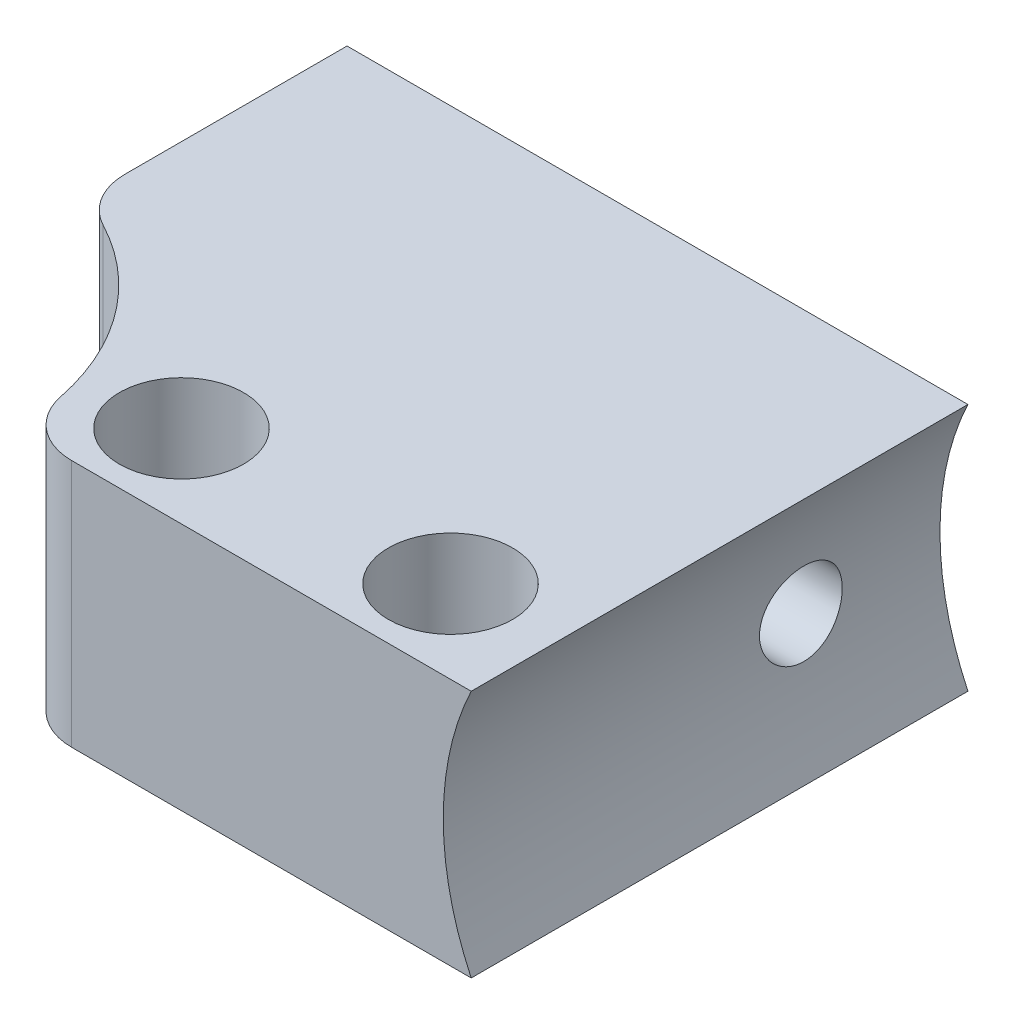
ISO-10303-21;
HEADER;
FILE_DESCRIPTION(('STEP AP214'),'2;1');
FILE_NAME('part.step','',(''),(''),'','','');
FILE_SCHEMA(('AUTOMOTIVE_DESIGN { 1 0 10303 214 1 1 1 1 }'));
ENDSEC;
DATA;
#1=APPLICATION_CONTEXT('core data for automotive mechanical design processes');
#2=APPLICATION_PROTOCOL_DEFINITION('international standard','automotive_design',2000,#1);
#3=PRODUCT_CONTEXT('',#1,'mechanical');
#4=PRODUCT('Part','Part','',(#3));
#5=PRODUCT_RELATED_PRODUCT_CATEGORY('part','',(#4));
#6=PRODUCT_DEFINITION_FORMATION('','',#4);
#7=PRODUCT_DEFINITION_CONTEXT('part definition',#1,'design');
#8=PRODUCT_DEFINITION('design','',#6,#7);
#9=PRODUCT_DEFINITION_SHAPE('','',#8);
#10=(LENGTH_UNIT() NAMED_UNIT(*) SI_UNIT(.MILLI.,.METRE.));
#11=(NAMED_UNIT(*) PLANE_ANGLE_UNIT() SI_UNIT($,.RADIAN.));
#12=(NAMED_UNIT(*) SI_UNIT($,.STERADIAN.) SOLID_ANGLE_UNIT());
#13=UNCERTAINTY_MEASURE_WITH_UNIT(LENGTH_MEASURE(1.E-05),#10,'distance_accuracy_value','');
#14=(GEOMETRIC_REPRESENTATION_CONTEXT(3) GLOBAL_UNCERTAINTY_ASSIGNED_CONTEXT((#13)) GLOBAL_UNIT_ASSIGNED_CONTEXT((#10,
#11,#12)) REPRESENTATION_CONTEXT('',''));
#15=CARTESIAN_POINT('',(0.,0.,0.));
#16=DIRECTION('',(0.,0.,1.));
#17=DIRECTION('',(1.,0.,0.));
#18=AXIS2_PLACEMENT_3D('',#15,#16,#17);
#19=CARTESIAN_POINT('',(0.,12.,0.));
#20=DIRECTION('',(1.,0.,0.));
#21=DIRECTION('',(0.,0.,-1.));
#22=AXIS2_PLACEMENT_3D('',#19,#20,#21);
#23=PLANE('',#22);
#24=DIRECTION('',(0.,-0.173648177666935,-0.984807753012207));
#25=VECTOR('',#24,1.);
#26=CARTESIAN_POINT('',(0.,9.25,0.));
#27=LINE('',#26,#25);
#28=CARTESIAN_POINT('',(0.,10.,4.25346136471317));
#29=VERTEX_POINT('',#28);
#30=CARTESIAN_POINT('',(0.,9.25,0.));
#31=VERTEX_POINT('',#30);
#32=EDGE_CURVE('E313',#29,#31,#27,.T.);
#33=ORIENTED_EDGE('',*,*,#32,.F.);
#34=CARTESIAN_POINT('',(0.,6.,6.72125390056379));
#35=DIRECTION('',(-1.,0.,0.));
#36=DIRECTION('',(0.,0.,-1.));
#37=AXIS2_PLACEMENT_3D('',#34,#35,#36);
#38=CIRCLE('',#37,4.7);
#39=CARTESIAN_POINT('',(0.,8.44783057183139,10.7335008385784));
#40=VERTEX_POINT('',#39);
#41=EDGE_CURVE('E312',#40,#29,#38,.T.);
#42=ORIENTED_EDGE('',*,*,#41,.F.);
#43=DIRECTION('',(0.,-1.,0.));
#44=VECTOR('',#43,1.);
#45=CARTESIAN_POINT('',(0.,12.,10.7335008385784));
#46=LINE('',#45,#44);
#47=CARTESIAN_POINT('',(0.,12.,10.7335008385784));
#48=VERTEX_POINT('',#47);
#49=EDGE_CURVE('E11',#48,#40,#46,.T.);
#50=ORIENTED_EDGE('',*,*,#49,.F.);
#51=DIRECTION('',(0.,0.,1.));
#52=VECTOR('',#51,1.);
#53=CARTESIAN_POINT('',(0.,12.,0.));
#54=LINE('',#53,#52);
#55=CARTESIAN_POINT('',(0.,12.,0.));
#56=VERTEX_POINT('',#55);
#57=EDGE_CURVE('E205',#56,#48,#54,.T.);
#58=ORIENTED_EDGE('',*,*,#57,.F.);
#59=DIRECTION('',(0.,-1.,0.));
#60=VECTOR('',#59,1.);
#61=CARTESIAN_POINT('',(0.,12.,0.));
#62=LINE('',#61,#60);
#63=EDGE_CURVE('E253',#56,#31,#62,.T.);
#64=ORIENTED_EDGE('',*,*,#63,.T.);
#65=EDGE_LOOP('',(#33,#42,#50,#58,#64));
#66=FACE_BOUND('',#65,.T.);
#67=ADVANCED_FACE('F43',(#66),#23,.F.);
#68=CARTESIAN_POINT('',(3.,12.,10.7335008385784));
#69=DIRECTION('',(0.,-1.,0.));
#70=DIRECTION('',(0.,0.,-1.));
#71=AXIS2_PLACEMENT_3D('',#68,#69,#70);
#72=PLANE('',#71);
#73=ORIENTED_EDGE('',*,*,#57,.T.);
#74=CARTESIAN_POINT('',(3.,12.,10.7335008385784));
#75=DIRECTION('',(0.,1.,0.));
#76=DIRECTION('',(0.,0.,-1.));
#77=AXIS2_PLACEMENT_3D('',#74,#75,#76);
#78=CIRCLE('',#77,3.);
#79=CARTESIAN_POINT('',(1.6,12.,13.3868006708627));
#80=VERTEX_POINT('',#79);
#81=EDGE_CURVE('E209',#48,#80,#78,.T.);
#82=ORIENTED_EDGE('',*,*,#81,.T.);
#83=CARTESIAN_POINT('',(-4.,12.,24.));
#84=DIRECTION('',(0.,-1.,0.));
#85=DIRECTION('',(0.,0.,1.));
#86=AXIS2_PLACEMENT_3D('',#83,#84,#85);
#87=CIRCLE('',#86,12.);
#88=CARTESIAN_POINT('',(7.75755076535926,12.,21.6));
#89=VERTEX_POINT('',#88);
#90=EDGE_CURVE('E213',#80,#89,#87,.T.);
#91=ORIENTED_EDGE('',*,*,#90,.T.);
#92=CARTESIAN_POINT('',(10.6969384566991,12.,21.));
#93=DIRECTION('',(0.,1.,0.));
#94=DIRECTION('',(0.,0.,1.));
#95=AXIS2_PLACEMENT_3D('',#92,#93,#94);
#96=CIRCLE('',#95,3.);
#97=CARTESIAN_POINT('',(10.6969384566991,12.,24.));
#98=VERTEX_POINT('',#97);
#99=EDGE_CURVE('E216',#89,#98,#96,.T.);
#100=ORIENTED_EDGE('',*,*,#99,.T.);
#101=DIRECTION('',(1.,0.,0.));
#102=VECTOR('',#101,1.);
#103=CARTESIAN_POINT('',(10.6969384566991,12.,24.));
#104=LINE('',#103,#102);
#105=CARTESIAN_POINT('',(30.,12.,24.));
#106=VERTEX_POINT('',#105);
#107=EDGE_CURVE('E219',#98,#106,#104,.T.);
#108=ORIENTED_EDGE('',*,*,#107,.T.);
#109=DIRECTION('',(0.,0.,-1.));
#110=VECTOR('',#109,1.);
#111=CARTESIAN_POINT('',(30.,12.,0.));
#112=LINE('',#111,#110);
#113=CARTESIAN_POINT('',(30.,12.,0.));
#114=VERTEX_POINT('',#113);
#115=EDGE_CURVE('E223',#106,#114,#112,.T.);
#116=ORIENTED_EDGE('',*,*,#115,.T.);
#117=DIRECTION('',(-1.,0.,0.));
#118=VECTOR('',#117,1.);
#119=CARTESIAN_POINT('',(0.,12.,0.));
#120=LINE('',#119,#118);
#121=EDGE_CURVE('E227',#114,#56,#120,.T.);
#122=ORIENTED_EDGE('',*,*,#121,.T.);
#123=EDGE_LOOP('',(#73,#82,#91,#100,#108,#116,#122));
#124=FACE_BOUND('',#123,.T.);
#125=CARTESIAN_POINT('',(12.,12.,20.));
#126=DIRECTION('',(0.,1.,0.));
#127=DIRECTION('',(0.,0.,1.));
#128=AXIS2_PLACEMENT_3D('',#125,#126,#127);
#129=CIRCLE('',#128,3.);
#130=CARTESIAN_POINT('',(12.,12.,23.));
#131=VERTEX_POINT('',#130);
#132=EDGE_CURVE('E197',#131,#131,#129,.T.);
#133=ORIENTED_EDGE('',*,*,#132,.F.);
#134=EDGE_LOOP('',(#133));
#135=FACE_BOUND('',#134,.T.);
#136=CARTESIAN_POINT('',(25.,12.,20.));
#137=DIRECTION('',(0.,1.,0.));
#138=DIRECTION('',(0.,0.,1.));
#139=AXIS2_PLACEMENT_3D('',#136,#137,#138);
#140=CIRCLE('',#139,3.);
#141=CARTESIAN_POINT('',(25.,12.,23.));
#142=VERTEX_POINT('',#141);
#143=EDGE_CURVE('E189',#142,#142,#140,.T.);
#144=ORIENTED_EDGE('',*,*,#143,.F.);
#145=EDGE_LOOP('',(#144));
#146=FACE_BOUND('',#145,.T.);
#147=ADVANCED_FACE('F305',(#124,#135,#146),#72,.F.);
#148=CARTESIAN_POINT('',(3.,0.,10.7335008385784));
#149=DIRECTION('',(0.,-1.,0.));
#150=DIRECTION('',(0.,0.,-1.));
#151=AXIS2_PLACEMENT_3D('',#148,#149,#150);
#152=PLANE('',#151);
#153=CARTESIAN_POINT('',(12.,0.,20.));
#154=DIRECTION('',(0.,1.,0.));
#155=DIRECTION('',(0.,0.,1.));
#156=AXIS2_PLACEMENT_3D('',#153,#154,#155);
#157=CIRCLE('',#156,3.);
#158=CARTESIAN_POINT('',(12.,0.,23.));
#159=VERTEX_POINT('',#158);
#160=EDGE_CURVE('E193',#159,#159,#157,.T.);
#161=ORIENTED_EDGE('',*,*,#160,.T.);
#162=EDGE_LOOP('',(#161));
#163=FACE_BOUND('',#162,.T.);
#164=DIRECTION('',(0.,0.,1.));
#165=VECTOR('',#164,1.);
#166=CARTESIAN_POINT('',(0.,0.,0.));
#167=LINE('',#166,#165);
#168=CARTESIAN_POINT('',(0.,0.,0.));
#169=VERTEX_POINT('',#168);
#170=CARTESIAN_POINT('',(0.,0.,10.7335008385784));
#171=VERTEX_POINT('',#170);
#172=EDGE_CURVE('E201',#169,#171,#167,.T.);
#173=ORIENTED_EDGE('',*,*,#172,.F.);
#174=DIRECTION('',(-1.,0.,0.));
#175=VECTOR('',#174,1.);
#176=CARTESIAN_POINT('',(0.,0.,0.));
#177=LINE('',#176,#175);
#178=CARTESIAN_POINT('',(30.,0.,0.));
#179=VERTEX_POINT('',#178);
#180=EDGE_CURVE('E210',#179,#169,#177,.T.);
#181=ORIENTED_EDGE('',*,*,#180,.F.);
#182=DIRECTION('',(0.,0.,-1.));
#183=VECTOR('',#182,1.);
#184=CARTESIAN_POINT('',(30.,0.,0.));
#185=LINE('',#184,#183);
#186=CARTESIAN_POINT('',(30.,0.,24.));
#187=VERTEX_POINT('',#186);
#188=EDGE_CURVE('E247',#187,#179,#185,.T.);
#189=ORIENTED_EDGE('',*,*,#188,.F.);
#190=DIRECTION('',(1.,0.,0.));
#191=VECTOR('',#190,1.);
#192=CARTESIAN_POINT('',(10.6969384566991,0.,24.));
#193=LINE('',#192,#191);
#194=CARTESIAN_POINT('',(10.6969384566991,0.,24.));
#195=VERTEX_POINT('',#194);
#196=EDGE_CURVE('E243',#195,#187,#193,.T.);
#197=ORIENTED_EDGE('',*,*,#196,.F.);
#198=CARTESIAN_POINT('',(10.6969384566991,0.,21.));
#199=DIRECTION('',(0.,1.,0.));
#200=DIRECTION('',(0.,0.,1.));
#201=AXIS2_PLACEMENT_3D('',#198,#199,#200);
#202=CIRCLE('',#201,3.);
#203=CARTESIAN_POINT('',(7.75755076535926,0.,21.6));
#204=VERTEX_POINT('',#203);
#205=EDGE_CURVE('E240',#204,#195,#202,.T.);
#206=ORIENTED_EDGE('',*,*,#205,.F.);
#207=CARTESIAN_POINT('',(-4.,0.,24.));
#208=DIRECTION('',(0.,-1.,0.));
#209=DIRECTION('',(0.,0.,1.));
#210=AXIS2_PLACEMENT_3D('',#207,#208,#209);
#211=CIRCLE('',#210,12.);
#212=CARTESIAN_POINT('',(1.6,0.,13.3868006708627));
#213=VERTEX_POINT('',#212);
#214=EDGE_CURVE('E237',#213,#204,#211,.T.);
#215=ORIENTED_EDGE('',*,*,#214,.F.);
#216=CARTESIAN_POINT('',(3.,0.,10.7335008385784));
#217=DIRECTION('',(0.,1.,0.));
#218=DIRECTION('',(0.,0.,-1.));
#219=AXIS2_PLACEMENT_3D('',#216,#217,#218);
#220=CIRCLE('',#219,3.);
#221=EDGE_CURVE('E234',#171,#213,#220,.T.);
#222=ORIENTED_EDGE('',*,*,#221,.F.);
#223=EDGE_LOOP('',(#173,#181,#189,#197,#206,#215,#222));
#224=FACE_BOUND('',#223,.T.);
#225=CARTESIAN_POINT('',(25.,0.,20.));
#226=DIRECTION('',(0.,1.,0.));
#227=DIRECTION('',(0.,0.,1.));
#228=AXIS2_PLACEMENT_3D('',#225,#226,#227);
#229=CIRCLE('',#228,3.);
#230=CARTESIAN_POINT('',(25.,0.,23.));
#231=VERTEX_POINT('',#230);
#232=EDGE_CURVE('E184',#231,#231,#229,.T.);
#233=ORIENTED_EDGE('',*,*,#232,.T.);
#234=EDGE_LOOP('',(#233));
#235=FACE_BOUND('',#234,.T.);
#236=ADVANCED_FACE('F280',(#163,#224,#235),#152,.T.);
#237=CARTESIAN_POINT('',(0.,3.55216942816861,10.7335008385784));
#238=VERTEX_POINT('',#237);
#239=EDGE_CURVE('E52',#238,#171,#46,.T.);
#240=ORIENTED_EDGE('',*,*,#239,.F.);
#241=CARTESIAN_POINT('',(0.,2.,4.25346136471317));
#242=VERTEX_POINT('',#241);
#243=EDGE_CURVE('E148',#242,#238,#38,.T.);
#244=ORIENTED_EDGE('',*,*,#243,.F.);
#245=DIRECTION('',(0.,-0.173648177666935,0.984807753012207));
#246=VECTOR('',#245,1.);
#247=CARTESIAN_POINT('',(0.,2.75,0.));
#248=LINE('',#247,#246);
#249=CARTESIAN_POINT('',(0.,2.75,0.));
#250=VERTEX_POINT('',#249);
#251=EDGE_CURVE('E162',#250,#242,#248,.T.);
#252=ORIENTED_EDGE('',*,*,#251,.F.);
#253=EDGE_CURVE('E230',#250,#169,#62,.T.);
#254=ORIENTED_EDGE('',*,*,#253,.T.);
#255=ORIENTED_EDGE('',*,*,#172,.T.);
#256=EDGE_LOOP('',(#240,#244,#252,#254,#255));
#257=FACE_BOUND('',#256,.T.);
#258=ADVANCED_FACE('F45',(#257),#23,.F.);
#259=CARTESIAN_POINT('',(3.,12.,10.7335008385784));
#260=DIRECTION('',(0.,-1.,0.));
#261=DIRECTION('',(0.,0.,-1.));
#262=AXIS2_PLACEMENT_3D('',#259,#260,#261);
#263=CYLINDRICAL_SURFACE('',#262,3.);
#264=ORIENTED_EDGE('',*,*,#49,.T.);
#265=CARTESIAN_POINT('',(0.,8.44783057183139,10.7335008385784));
#266=CARTESIAN_POINT('',(3.22848007456358E-05,8.33911370752731,10.7998417411518));
#267=CARTESIAN_POINT('',(0.00220105297650717,8.22772538207866,10.8617213767104));
#268=CARTESIAN_POINT('',(0.0092749974576445,8.00039985216988,10.9761992805747));
#269=CARTESIAN_POINT('',(0.0141792805831064,7.88446414396832,11.0288005710014));
#270=CARTESIAN_POINT('',(0.0251908529526046,7.64874172640499,11.1244165171131));
#271=CARTESIAN_POINT('',(0.031298389266853,7.52895423036985,11.1674292000467));
#272=CARTESIAN_POINT('',(0.0434337248098854,7.28627310624521,11.2436066320866));
#273=CARTESIAN_POINT('',(0.0494615179010025,7.16337924115968,11.2767706273254));
#274=CARTESIAN_POINT('',(0.0605194882570723,6.91200521097047,11.3337680647829));
#275=CARTESIAN_POINT('',(0.0655194235636561,6.78346302251668,11.3573345619969));
#276=CARTESIAN_POINT('',(0.0734832271896319,6.52479909119613,11.3936881712691));
#277=CARTESIAN_POINT('',(0.0764471134612076,6.39467736226674,11.4064753783702));
#278=CARTESIAN_POINT('',(0.0798667490788225,6.13383319051693,11.4211630344315));
#279=CARTESIAN_POINT('',(0.0803234025959335,6.00311098126788,11.4230674080247));
#280=CARTESIAN_POINT('',(0.0786594980708049,5.74198401700114,11.4159835574858));
#281=CARTESIAN_POINT('',(0.0765390360840565,5.61157925033312,11.4069957393328));
#282=CARTESIAN_POINT('',(0.0700823917217564,5.3531001404811,11.37832279368));
#283=CARTESIAN_POINT('',(0.0657646206155782,5.22501544799439,11.3587264692873));
#284=CARTESIAN_POINT('',(0.0556164714285627,4.9709406296529,11.3090415193193));
#285=CARTESIAN_POINT('',(0.0497858618877142,4.84495082745184,11.2789512879632));
#286=CARTESIAN_POINT('',(0.0376312896026204,4.59602908724721,11.2085228598993));
#287=CARTESIAN_POINT('',(0.0313078044952147,4.47309433737388,11.1681945012771));
#288=CARTESIAN_POINT('',(0.0194429075717272,4.23098271431091,11.0775452022529));
#289=CARTESIAN_POINT('',(0.0139010971914246,4.1118039502499,11.0272293860418));
#290=CARTESIAN_POINT('',(0.00664621753725829,3.91900018001498,10.9362842772416));
#291=CARTESIAN_POINT('',(0.00427201644440521,3.84406857985687,10.8984538608084));
#292=CARTESIAN_POINT('',(0.000952739144353319,3.69643202585047,10.818887180919));
#293=CARTESIAN_POINT('',(5.38821136747314E-06,3.62372370929532,10.7771572472457));
#294=CARTESIAN_POINT('',(0.,3.55216942816861,10.7335008385784));
#295=B_SPLINE_CURVE_WITH_KNOTS('',3,(#265,#266,#267,#268,#269,#270,#271,#272,#273,#274,#275,
#276,#277,#278,#279,#280,#281,#282,#283,#284,#285,#286,#287,#288,#289,#290,#291,#292,#293,#294),
.UNSPECIFIED.,.F.,.F.,(4,2,2,2,2,2,2,2,2,2,2,2,2,2,4),(0.,0.381896646155295,0.763668671201081,
1.14551916933228,1.52739888866845,1.91927417544204,2.31114600694158,2.70287651033457,
3.09459241340721,3.48307887892982,3.87162481686941,4.25979879476779,4.64777412750616,
4.89957182754404,5.15096767792404),.UNSPECIFIED.);
#296=EDGE_CURVE('E164',#40,#238,#295,.T.);
#297=ORIENTED_EDGE('',*,*,#296,.T.);
#298=ORIENTED_EDGE('',*,*,#239,.T.);
#299=ORIENTED_EDGE('',*,*,#221,.T.);
#300=DIRECTION('',(0.,-1.,0.));
#301=VECTOR('',#300,1.);
#302=CARTESIAN_POINT('',(1.6,12.,13.3868006708627));
#303=LINE('',#302,#301);
#304=EDGE_CURVE('E264',#80,#213,#303,.T.);
#305=ORIENTED_EDGE('',*,*,#304,.F.);
#306=ORIENTED_EDGE('',*,*,#81,.F.);
#307=EDGE_LOOP('',(#264,#297,#298,#299,#305,#306));
#308=FACE_BOUND('',#307,.T.);
#309=ADVANCED_FACE('F276',(#308),#263,.T.);
#310=CARTESIAN_POINT('',(-4.,12.,24.));
#311=DIRECTION('',(0.,-1.,0.));
#312=DIRECTION('',(0.,0.,-1.));
#313=AXIS2_PLACEMENT_3D('',#310,#311,#312);
#314=CYLINDRICAL_SURFACE('',#313,12.);
#315=ORIENTED_EDGE('',*,*,#214,.T.);
#316=DIRECTION('',(0.,-1.,0.));
#317=VECTOR('',#316,1.);
#318=CARTESIAN_POINT('',(7.75755076535926,12.,21.6));
#319=LINE('',#318,#317);
#320=EDGE_CURVE('E261',#89,#204,#319,.T.);
#321=ORIENTED_EDGE('',*,*,#320,.F.);
#322=ORIENTED_EDGE('',*,*,#90,.F.);
#323=ORIENTED_EDGE('',*,*,#304,.T.);
#324=EDGE_LOOP('',(#315,#321,#322,#323));
#325=FACE_BOUND('',#324,.T.);
#326=ADVANCED_FACE('F303',(#325),#314,.F.);
#327=CARTESIAN_POINT('',(10.6969384566991,12.,21.));
#328=DIRECTION('',(0.,-1.,0.));
#329=DIRECTION('',(0.,0.,-1.));
#330=AXIS2_PLACEMENT_3D('',#327,#328,#329);
#331=CYLINDRICAL_SURFACE('',#330,3.);
#332=ORIENTED_EDGE('',*,*,#205,.T.);
#333=DIRECTION('',(0.,-1.,0.));
#334=VECTOR('',#333,1.);
#335=CARTESIAN_POINT('',(10.6969384566991,12.,24.));
#336=LINE('',#335,#334);
#337=EDGE_CURVE('E257',#98,#195,#336,.T.);
#338=ORIENTED_EDGE('',*,*,#337,.F.);
#339=ORIENTED_EDGE('',*,*,#99,.F.);
#340=ORIENTED_EDGE('',*,*,#320,.T.);
#341=EDGE_LOOP('',(#332,#338,#339,#340));
#342=FACE_BOUND('',#341,.T.);
#343=ADVANCED_FACE('F301',(#342),#331,.T.);
#344=CARTESIAN_POINT('',(10.6969384566991,12.,24.));
#345=DIRECTION('',(0.,0.,-1.));
#346=DIRECTION('',(-1.,0.,0.));
#347=AXIS2_PLACEMENT_3D('',#344,#345,#346);
#348=PLANE('',#347);
#349=ORIENTED_EDGE('',*,*,#196,.T.);
#350=CARTESIAN_POINT('',(42.6491106406735,6.,24.));
#351=DIRECTION('',(0.,0.,-1.));
#352=DIRECTION('',(-1.,0.,0.));
#353=AXIS2_PLACEMENT_3D('',#350,#351,#352);
#354=CIRCLE('',#353,14.);
#355=EDGE_CURVE('E180',#187,#106,#354,.T.);
#356=ORIENTED_EDGE('',*,*,#355,.T.);
#357=ORIENTED_EDGE('',*,*,#107,.F.);
#358=ORIENTED_EDGE('',*,*,#337,.T.);
#359=EDGE_LOOP('',(#349,#356,#357,#358));
#360=FACE_BOUND('',#359,.T.);
#361=ADVANCED_FACE('F297',(#360),#348,.F.);
#362=CARTESIAN_POINT('',(0.,12.,0.));
#363=DIRECTION('',(0.,0.,1.));
#364=DIRECTION('',(1.,0.,0.));
#365=AXIS2_PLACEMENT_3D('',#362,#363,#364);
#366=PLANE('',#365);
#367=ORIENTED_EDGE('',*,*,#253,.F.);
#368=DIRECTION('',(-1.,0.,0.));
#369=VECTOR('',#368,1.);
#370=CARTESIAN_POINT('',(23.,2.75,0.));
#371=LINE('',#370,#369);
#372=CARTESIAN_POINT('',(23.,2.75,0.));
#373=VERTEX_POINT('',#372);
#374=EDGE_CURVE('E188',#373,#250,#371,.T.);
#375=ORIENTED_EDGE('',*,*,#374,.F.);
#376=DIRECTION('',(0.,-1.,0.));
#377=VECTOR('',#376,1.);
#378=CARTESIAN_POINT('',(23.,2.75,0.));
#379=LINE('',#378,#377);
#380=CARTESIAN_POINT('',(23.,9.25,0.));
#381=VERTEX_POINT('',#380);
#382=EDGE_CURVE('E171',#381,#373,#379,.T.);
#383=ORIENTED_EDGE('',*,*,#382,.F.);
#384=DIRECTION('',(-1.,0.,0.));
#385=VECTOR('',#384,1.);
#386=CARTESIAN_POINT('',(23.,9.25,0.));
#387=LINE('',#386,#385);
#388=EDGE_CURVE('E175',#381,#31,#387,.T.);
#389=ORIENTED_EDGE('',*,*,#388,.T.);
#390=ORIENTED_EDGE('',*,*,#63,.F.);
#391=ORIENTED_EDGE('',*,*,#121,.F.);
#392=CARTESIAN_POINT('',(42.6491106406735,6.,0.));
#393=DIRECTION('',(0.,0.,-1.));
#394=DIRECTION('',(-1.,0.,0.));
#395=AXIS2_PLACEMENT_3D('',#392,#393,#394);
#396=CIRCLE('',#395,14.);
#397=EDGE_CURVE('E185',#179,#114,#396,.T.);
#398=ORIENTED_EDGE('',*,*,#397,.F.);
#399=ORIENTED_EDGE('',*,*,#180,.T.);
#400=EDGE_LOOP('',(#367,#375,#383,#389,#390,#391,#398,#399));
#401=FACE_BOUND('',#400,.T.);
#402=ADVANCED_FACE('F289',(#401),#366,.F.);
#403=CARTESIAN_POINT('',(12.,12.,20.));
#404=DIRECTION('',(0.,-1.,0.));
#405=DIRECTION('',(0.,0.,-1.));
#406=AXIS2_PLACEMENT_3D('',#403,#404,#405);
#407=CYLINDRICAL_SURFACE('',#406,3.);
#408=ORIENTED_EDGE('',*,*,#132,.T.);
#409=EDGE_LOOP('',(#408));
#410=FACE_BOUND('',#409,.T.);
#411=ORIENTED_EDGE('',*,*,#160,.F.);
#412=EDGE_LOOP('',(#411));
#413=FACE_BOUND('',#412,.T.);
#414=ADVANCED_FACE('F389',(#410,#413),#407,.F.);
#415=CARTESIAN_POINT('',(25.,12.,20.));
#416=DIRECTION('',(0.,-1.,0.));
#417=DIRECTION('',(0.,0.,-1.));
#418=AXIS2_PLACEMENT_3D('',#415,#416,#417);
#419=CYLINDRICAL_SURFACE('',#418,3.);
#420=ORIENTED_EDGE('',*,*,#143,.T.);
#421=EDGE_LOOP('',(#420));
#422=FACE_BOUND('',#421,.T.);
#423=ORIENTED_EDGE('',*,*,#232,.F.);
#424=EDGE_LOOP('',(#423));
#425=FACE_BOUND('',#424,.T.);
#426=ADVANCED_FACE('F355',(#422,#425),#419,.F.);
#427=CARTESIAN_POINT('',(42.6491106406735,6.,24.));
#428=DIRECTION('',(0.,0.,-1.));
#429=DIRECTION('',(-1.,0.,0.));
#430=AXIS2_PLACEMENT_3D('',#427,#428,#429);
#431=CYLINDRICAL_SURFACE('',#430,14.);
#432=CARTESIAN_POINT('',(28.6491106406735,6.,8.72125390056378));
#433=CARTESIAN_POINT('',(28.6491123702159,6.11173072941282,8.72124924738616));
#434=CARTESIAN_POINT('',(28.6504622366676,6.22352781099103,8.71185948624498));
#435=CARTESIAN_POINT('',(28.655717230556,6.44400132073616,8.6745556280958));
#436=CARTESIAN_POINT('',(28.6596249007474,6.55267453106696,8.64662309702302));
#437=CARTESIAN_POINT('',(28.6695560374371,6.76367735357088,8.57308177709533));
#438=CARTESIAN_POINT('',(28.6755779573076,6.86601153869954,8.52748590691077));
#439=CARTESIAN_POINT('',(28.6890708590618,7.06155930048063,8.41994281477307));
#440=CARTESIAN_POINT('',(28.6965416253731,7.1547742308773,8.35799802486462));
#441=CARTESIAN_POINT('',(28.7121598582557,7.33011730079463,8.21904555822925));
#442=CARTESIAN_POINT('',(28.720311325324,7.4121711816013,8.14194461484795));
#443=CARTESIAN_POINT('',(28.7363406442492,7.56222258353726,7.97506907148447));
#444=CARTESIAN_POINT('',(28.7442184809174,7.63021932541739,7.88529376937074));
#445=CARTESIAN_POINT('',(28.7588475108598,7.75051175284446,7.69512366845627));
#446=CARTESIAN_POINT('',(28.7655935366809,7.80273625094777,7.59468340799348));
#447=CARTESIAN_POINT('',(28.7771409875478,7.8895469033362,7.38634482158167));
#448=CARTESIAN_POINT('',(28.7819425086692,7.92413392908997,7.27844686441714));
#449=CARTESIAN_POINT('',(28.7890182531417,7.97445864012233,7.05903388090775));
#450=CARTESIAN_POINT('',(28.7913094502015,7.99032297705591,6.94754846070814));
#451=CARTESIAN_POINT('',(28.7931567637651,8.00314420015137,6.72347608969418));
#452=CARTESIAN_POINT('',(28.7927130229327,8.00010207253958,6.61088919664234));
#453=CARTESIAN_POINT('',(28.7891561252529,7.97530036195882,6.38870080989764));
#454=CARTESIAN_POINT('',(28.7860630186311,7.95368136359299,6.27908325647208));
#455=CARTESIAN_POINT('',(28.7775872068834,7.89255944642857,6.06504772799526));
#456=CARTESIAN_POINT('',(28.7722044425227,7.85305606494963,5.96062988754146));
#457=CARTESIAN_POINT('',(28.759733485968,7.75713904249907,5.75952735434693));
#458=CARTESIAN_POINT('',(28.7526392590484,7.70066538623268,5.66287167579218));
#459=CARTESIAN_POINT('',(28.7375491628722,7.57245369144076,5.48035547618518));
#460=CARTESIAN_POINT('',(28.7295532398832,7.5007147430251,5.3944955991039));
#461=CARTESIAN_POINT('',(28.7134719270645,7.34323491742878,5.23519309433452));
#462=CARTESIAN_POINT('',(28.7053863829829,7.25737307515522,5.16187001044387));
#463=CARTESIAN_POINT('',(28.6901042827616,7.07449831880178,5.03065689811726));
#464=CARTESIAN_POINT('',(28.682907729889,6.97748536374498,4.97276692639585));
#465=CARTESIAN_POINT('',(28.6702079344041,6.77496207962769,4.8740590255652));
#466=CARTESIAN_POINT('',(28.6647055545531,6.66944745546731,4.83324979106952));
#467=CARTESIAN_POINT('',(28.6560214417531,6.4529666987542,4.76996296192429));
#468=CARTESIAN_POINT('',(28.6528395666304,6.34200090063128,4.74748424418197));
#469=CARTESIAN_POINT('',(28.6491736949462,6.11880002238995,4.72165427374336));
#470=CARTESIAN_POINT('',(28.6486665044287,6.00658433954239,4.71813857409529));
#471=CARTESIAN_POINT('',(28.6503441679965,5.78316514968671,4.72989870858387));
#472=CARTESIAN_POINT('',(28.6525289467004,5.67196161442394,4.74517401652887));
#473=CARTESIAN_POINT('',(28.6593307033505,5.45421758201551,4.7939458421585));
#474=CARTESIAN_POINT('',(28.6639370533726,5.34765889507988,4.82736275974334));
#475=CARTESIAN_POINT('',(28.6750668979492,5.14165705597532,4.9113856398592));
#476=CARTESIAN_POINT('',(28.6815904751872,5.04221421091892,4.96199234374292));
#477=CARTESIAN_POINT('',(28.6958868689642,4.85254030420214,5.07934771755125));
#478=CARTESIAN_POINT('',(28.7036676921814,4.76237478730203,5.14620133026924));
#479=CARTESIAN_POINT('',(28.7195861763658,4.59448470519514,5.29400597661605));
#480=CARTESIAN_POINT('',(28.7277238560321,4.51676079292142,5.37495774964845));
#481=CARTESIAN_POINT('',(28.7435118389765,4.37536635379233,5.54939060152824));
#482=CARTESIAN_POINT('',(28.7511580251884,4.31180569915162,5.64296117086431));
#483=CARTESIAN_POINT('',(28.7650259258654,4.20130431246086,5.83954708716778));
#484=CARTESIAN_POINT('',(28.7712476759377,4.15436316494917,5.9425621979554));
#485=CARTESIAN_POINT('',(28.7815329380559,4.07860589241467,6.15477720507007));
#486=CARTESIAN_POINT('',(28.7856034768812,4.0497306986803,6.26395565940509));
#487=CARTESIAN_POINT('',(28.7911445480292,4.01073626799847,6.48567446161939));
#488=CARTESIAN_POINT('',(28.7926152418448,4.00061586606981,6.59821460024147));
#489=CARTESIAN_POINT('',(28.7927844632228,3.99944409625789,6.82236772708507));
#490=CARTESIAN_POINT('',(28.7915080974417,4.00822002632194,6.9339798322191));
#491=CARTESIAN_POINT('',(28.7863813985537,4.044223041492,7.15412402462225));
#492=CARTESIAN_POINT('',(28.7825310680988,4.07145010758649,7.26265611506481));
#493=CARTESIAN_POINT('',(28.7726987458984,4.14352354434204,7.47351916567496));
#494=CARTESIAN_POINT('',(28.7667180784966,4.18835897037399,7.57585393232682));
#495=CARTESIAN_POINT('',(28.7532971833997,4.29435935796913,7.77157634551719));
#496=CARTESIAN_POINT('',(28.7458569156139,4.35552476808161,7.86496374619518));
#497=CARTESIAN_POINT('',(28.7302740141446,4.49308052536905,8.0410197190927));
#498=CARTESIAN_POINT('',(28.722125818037,4.56959907059635,8.12358764576602));
#499=CARTESIAN_POINT('',(28.7060924201329,4.73541848667885,8.27477360799601));
#500=CARTESIAN_POINT('',(28.6982072801402,4.82472233566506,8.34338838435228));
#501=CARTESIAN_POINT('',(28.6835440157479,5.01409657546615,8.46502147259993));
#502=CARTESIAN_POINT('',(28.6767715894782,5.1142182825457,8.51796055472168));
#503=CARTESIAN_POINT('',(28.6651530799247,5.32197871162996,8.60619364456988));
#504=CARTESIAN_POINT('',(28.6603049726427,5.42960939480102,8.64150620199617));
#505=CARTESIAN_POINT('',(28.654207010623,5.61478863600244,8.68533748747641));
#506=CARTESIAN_POINT('',(28.6523055321089,5.69118610082143,8.69878593750203));
#507=CARTESIAN_POINT('',(28.6497567540956,5.84504507863434,8.71674570965198));
#508=CARTESIAN_POINT('',(28.6491094411096,5.92250658017694,8.72125712788226));
#509=CARTESIAN_POINT('',(28.6491106406735,6.,8.72125390056378));
#510=B_SPLINE_CURVE_WITH_KNOTS('',3,(#432,#433,#434,#435,#436,#437,#438,#439,#440,#441,#442,
#443,#444,#445,#446,#447,#448,#449,#450,#451,#452,#453,#454,#455,#456,#457,#458,#459,#460,#461,
#462,#463,#464,#465,#466,#467,#468,#469,#470,#471,#472,#473,#474,#475,#476,#477,#478,#479,#480,
#481,#482,#483,#484,#485,#486,#487,#488,#489,#490,#491,#492,#493,#494,#495,#496,#497,#498,#499,
#500,#501,#502,#503,#504,#505,#506,#507,#508,#509),.UNSPECIFIED.,.T.,.F.,(4,2,2,2,2,2,2,2,2,2,2,
2,2,2,2,2,2,2,2,2,2,2,2,2,2,2,2,2,2,2,2,2,2,2,2,2,2,2,4),(0.,0.334909053352878,
0.670151551991671,1.00514932139371,1.34009728501034,1.67717486857614,2.01427113282988,
2.35286688085115,2.69144589721316,3.02772118641954,3.36397893449559,3.69771416579721,
4.03145803153491,4.36639635621899,4.70135465054929,5.03934756706696,5.3773417256446,
5.71550772487662,6.05365300345248,6.38886112086085,6.72405985188059,7.0577995773694,
7.3915536980499,7.72752375986629,8.06351144755165,8.40202124724692,8.74052258413026,
9.07791128740849,9.41527903259351,9.74957651847121,10.0838736598988,10.4179633440508,
10.7520622058671,11.0890764750947,11.4261693744911,11.7649380499931,12.1033494584613,
12.3356358411576,12.5679197259081),.UNSPECIFIED.);
#511=CARTESIAN_POINT('',(28.6491106406735,6.,8.72125390056378));
#512=VERTEX_POINT('',#511);
#513=EDGE_CURVE('E315',#512,#512,#510,.T.);
#514=ORIENTED_EDGE('',*,*,#513,.T.);
#515=EDGE_LOOP('',(#514));
#516=FACE_BOUND('',#515,.T.);
#517=ORIENTED_EDGE('',*,*,#397,.T.);
#518=ORIENTED_EDGE('',*,*,#115,.F.);
#519=ORIENTED_EDGE('',*,*,#355,.F.);
#520=ORIENTED_EDGE('',*,*,#188,.T.);
#521=EDGE_LOOP('',(#517,#518,#519,#520));
#522=FACE_BOUND('',#521,.T.);
#523=ADVANCED_FACE('F294',(#516,#522),#431,.F.);
#524=CARTESIAN_POINT('',(23.,2.75,0.));
#525=DIRECTION('',(0.,-0.984807753012207,-0.173648177666935));
#526=DIRECTION('',(0.,0.173648177666935,-0.984807753012207));
#527=AXIS2_PLACEMENT_3D('',#524,#525,#526);
#528=PLANE('',#527);
#529=ORIENTED_EDGE('',*,*,#251,.T.);
#530=DIRECTION('',(-1.,0.,0.));
#531=VECTOR('',#530,1.);
#532=CARTESIAN_POINT('',(3.,2.,4.25346136471317));
#533=LINE('',#532,#531);
#534=CARTESIAN_POINT('',(3.,2.,4.25346136471317));
#535=VERTEX_POINT('',#534);
#536=EDGE_CURVE('E141',#535,#242,#533,.T.);
#537=ORIENTED_EDGE('',*,*,#536,.F.);
#538=DIRECTION('',(-1.,0.,0.));
#539=VECTOR('',#538,1.);
#540=CARTESIAN_POINT('',(23.,2.,4.25346136471317));
#541=LINE('',#540,#539);
#542=CARTESIAN_POINT('',(23.,2.,4.25346136471317));
#543=VERTEX_POINT('',#542);
#544=EDGE_CURVE('E159',#543,#535,#541,.T.);
#545=ORIENTED_EDGE('',*,*,#544,.F.);
#546=DIRECTION('',(0.,-0.173648177666935,0.984807753012207));
#547=VECTOR('',#546,1.);
#548=CARTESIAN_POINT('',(23.,2.75,0.));
#549=LINE('',#548,#547);
#550=EDGE_CURVE('E332',#373,#543,#549,.T.);
#551=ORIENTED_EDGE('',*,*,#550,.F.);
#552=ORIENTED_EDGE('',*,*,#374,.T.);
#553=EDGE_LOOP('',(#529,#537,#545,#551,#552));
#554=FACE_BOUND('',#553,.T.);
#555=ADVANCED_FACE('F158',(#554),#528,.F.);
#556=CARTESIAN_POINT('',(23.,9.25,0.));
#557=DIRECTION('',(0.,0.984807753012207,-0.173648177666935));
#558=DIRECTION('',(0.,0.173648177666935,0.984807753012207));
#559=AXIS2_PLACEMENT_3D('',#556,#557,#558);
#560=PLANE('',#559);
#561=ORIENTED_EDGE('',*,*,#32,.T.);
#562=ORIENTED_EDGE('',*,*,#388,.F.);
#563=DIRECTION('',(0.,-0.173648177666935,-0.984807753012207));
#564=VECTOR('',#563,1.);
#565=CARTESIAN_POINT('',(23.,9.25,0.));
#566=LINE('',#565,#564);
#567=CARTESIAN_POINT('',(23.,10.,4.25346136471317));
#568=VERTEX_POINT('',#567);
#569=EDGE_CURVE('E66',#568,#381,#566,.T.);
#570=ORIENTED_EDGE('',*,*,#569,.F.);
#571=DIRECTION('',(-1.,0.,0.));
#572=VECTOR('',#571,1.);
#573=CARTESIAN_POINT('',(23.,10.,4.25346136471317));
#574=LINE('',#573,#572);
#575=CARTESIAN_POINT('',(3.,10.,4.25346136471317));
#576=VERTEX_POINT('',#575);
#577=EDGE_CURVE('E170',#568,#576,#574,.T.);
#578=ORIENTED_EDGE('',*,*,#577,.T.);
#579=DIRECTION('',(-1.,0.,0.));
#580=VECTOR('',#579,1.);
#581=CARTESIAN_POINT('',(3.,10.,4.25346136471317));
#582=LINE('',#581,#580);
#583=EDGE_CURVE('E144',#576,#29,#582,.T.);
#584=ORIENTED_EDGE('',*,*,#583,.T.);
#585=EDGE_LOOP('',(#561,#562,#570,#578,#584));
#586=FACE_BOUND('',#585,.T.);
#587=ADVANCED_FACE('F344',(#586),#560,.F.);
#588=CARTESIAN_POINT('',(23.,10.,4.25346136471317));
#589=DIRECTION('',(0.,0.,1.));
#590=DIRECTION('',(1.,0.,0.));
#591=AXIS2_PLACEMENT_3D('',#588,#589,#590);
#592=PLANE('',#591);
#593=ORIENTED_EDGE('',*,*,#544,.T.);
#594=DIRECTION('',(0.,-1.,0.));
#595=VECTOR('',#594,1.);
#596=CARTESIAN_POINT('',(3.,10.,4.25346136471317));
#597=LINE('',#596,#595);
#598=EDGE_CURVE('E147',#576,#535,#597,.T.);
#599=ORIENTED_EDGE('',*,*,#598,.F.);
#600=ORIENTED_EDGE('',*,*,#577,.F.);
#601=DIRECTION('',(0.,1.,0.));
#602=VECTOR('',#601,1.);
#603=CARTESIAN_POINT('',(23.,10.,4.25346136471317));
#604=LINE('',#603,#602);
#605=EDGE_CURVE('E167',#543,#568,#604,.T.);
#606=ORIENTED_EDGE('',*,*,#605,.F.);
#607=EDGE_LOOP('',(#593,#599,#600,#606));
#608=FACE_BOUND('',#607,.T.);
#609=ADVANCED_FACE('F166',(#608),#592,.F.);
#610=CARTESIAN_POINT('',(23.,0.,0.));
#611=DIRECTION('',(1.,0.,0.));
#612=DIRECTION('',(0.,0.,-1.));
#613=AXIS2_PLACEMENT_3D('',#610,#611,#612);
#614=PLANE('',#613);
#615=ORIENTED_EDGE('',*,*,#550,.T.);
#616=ORIENTED_EDGE('',*,*,#605,.T.);
#617=ORIENTED_EDGE('',*,*,#569,.T.);
#618=ORIENTED_EDGE('',*,*,#382,.T.);
#619=EDGE_LOOP('',(#615,#616,#617,#618));
#620=FACE_BOUND('',#619,.T.);
#621=ADVANCED_FACE('F340',(#620),#614,.F.);
#622=CARTESIAN_POINT('',(3.,6.,6.72125390056379));
#623=DIRECTION('',(-1.,0.,0.));
#624=DIRECTION('',(0.,0.,1.));
#625=AXIS2_PLACEMENT_3D('',#622,#623,#624);
#626=CYLINDRICAL_SURFACE('',#625,4.7);
#627=ORIENTED_EDGE('',*,*,#41,.T.);
#628=ORIENTED_EDGE('',*,*,#583,.F.);
#629=CARTESIAN_POINT('',(3.,6.,6.72125390056379));
#630=DIRECTION('',(-1.,0.,0.));
#631=DIRECTION('',(0.,0.,-1.));
#632=AXIS2_PLACEMENT_3D('',#629,#630,#631);
#633=CIRCLE('',#632,4.7);
#634=EDGE_CURVE('E58',#535,#576,#633,.T.);
#635=ORIENTED_EDGE('',*,*,#634,.F.);
#636=ORIENTED_EDGE('',*,*,#536,.T.);
#637=ORIENTED_EDGE('',*,*,#243,.T.);
#638=ORIENTED_EDGE('',*,*,#296,.F.);
#639=EDGE_LOOP('',(#627,#628,#635,#636,#637,#638));
#640=FACE_BOUND('',#639,.T.);
#641=ADVANCED_FACE('F139',(#640),#626,.F.);
#642=CARTESIAN_POINT('',(3.,6.,6.72125390056379));
#643=DIRECTION('',(1.,0.,0.));
#644=DIRECTION('',(0.,0.,-1.));
#645=AXIS2_PLACEMENT_3D('',#642,#643,#644);
#646=PLANE('',#645);
#647=CARTESIAN_POINT('',(3.,6.,6.72125390056379));
#648=DIRECTION('',(1.,0.,0.));
#649=DIRECTION('',(0.,0.,-1.));
#650=AXIS2_PLACEMENT_3D('',#647,#648,#649);
#651=CIRCLE('',#650,2.);
#652=CARTESIAN_POINT('',(3.,6.,4.72125390056379));
#653=VERTEX_POINT('',#652);
#654=EDGE_CURVE('E320',#653,#653,#651,.T.);
#655=ORIENTED_EDGE('',*,*,#654,.T.);
#656=EDGE_LOOP('',(#655));
#657=FACE_BOUND('',#656,.T.);
#658=ORIENTED_EDGE('',*,*,#634,.T.);
#659=ORIENTED_EDGE('',*,*,#598,.T.);
#660=EDGE_LOOP('',(#658,#659));
#661=FACE_BOUND('',#660,.T.);
#662=ADVANCED_FACE('F150',(#657,#661),#646,.F.);
#663=CARTESIAN_POINT('',(30.,6.,6.72125390056378));
#664=DIRECTION('',(-1.,0.,0.));
#665=DIRECTION('',(0.,0.,1.));
#666=AXIS2_PLACEMENT_3D('',#663,#664,#665);
#667=CYLINDRICAL_SURFACE('',#666,2.);
#668=ORIENTED_EDGE('',*,*,#654,.F.);
#669=EDGE_LOOP('',(#668));
#670=FACE_BOUND('',#669,.T.);
#671=ORIENTED_EDGE('',*,*,#513,.F.);
#672=EDGE_LOOP('',(#671));
#673=FACE_BOUND('',#672,.T.);
#674=ADVANCED_FACE('F362',(#670,#673),#667,.F.);
#675=CLOSED_SHELL('',(#67,#147,#236,#258,#309,#326,#343,#361,#402,#414,#426,#523,#555,#587,#609,
#621,#641,#662,#674));
#676=MANIFOLD_SOLID_BREP('B2',#675);
#677=ADVANCED_BREP_SHAPE_REPRESENTATION('',(#18,#676),#14);
#678=SHAPE_DEFINITION_REPRESENTATION(#9,#677);
ENDSEC;
END-ISO-10303-21;
